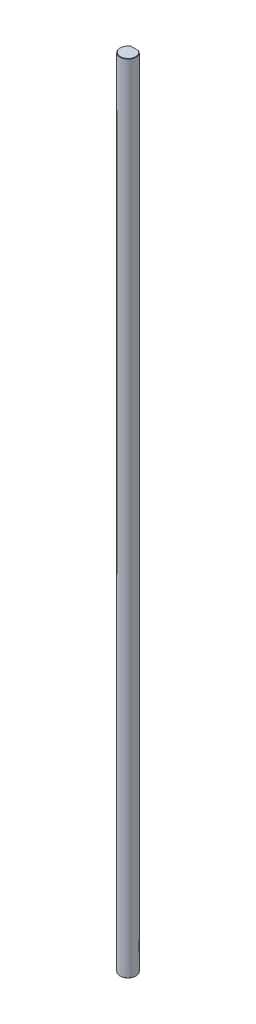
ISO-10303-21;
HEADER;
FILE_DESCRIPTION(('STEP AP214'),'2;1');
FILE_NAME('part.step','',(''),(''),'','','');
FILE_SCHEMA(('AUTOMOTIVE_DESIGN { 1 0 10303 214 1 1 1 1 }'));
ENDSEC;
DATA;
#1=APPLICATION_CONTEXT('core data for automotive mechanical design processes');
#2=APPLICATION_PROTOCOL_DEFINITION('international standard','automotive_design',2000,#1);
#3=PRODUCT_CONTEXT('',#1,'mechanical');
#4=PRODUCT('Part','Part','',(#3));
#5=PRODUCT_RELATED_PRODUCT_CATEGORY('part','',(#4));
#6=PRODUCT_DEFINITION_FORMATION('','',#4);
#7=PRODUCT_DEFINITION_CONTEXT('part definition',#1,'design');
#8=PRODUCT_DEFINITION('design','',#6,#7);
#9=PRODUCT_DEFINITION_SHAPE('','',#8);
#10=(LENGTH_UNIT() NAMED_UNIT(*) SI_UNIT(.MILLI.,.METRE.));
#11=(NAMED_UNIT(*) PLANE_ANGLE_UNIT() SI_UNIT($,.RADIAN.));
#12=(NAMED_UNIT(*) SI_UNIT($,.STERADIAN.) SOLID_ANGLE_UNIT());
#13=UNCERTAINTY_MEASURE_WITH_UNIT(LENGTH_MEASURE(1.E-05),#10,'distance_accuracy_value','');
#14=(GEOMETRIC_REPRESENTATION_CONTEXT(3) GLOBAL_UNCERTAINTY_ASSIGNED_CONTEXT((#13)) GLOBAL_UNIT_ASSIGNED_CONTEXT((#10,
#11,#12)) REPRESENTATION_CONTEXT('',''));
#15=CARTESIAN_POINT('',(0.,0.,0.));
#16=DIRECTION('',(0.,0.,1.));
#17=DIRECTION('',(1.,0.,0.));
#18=AXIS2_PLACEMENT_3D('',#15,#16,#17);
#19=CARTESIAN_POINT('',(0.,300.,0.));
#20=DIRECTION('',(0.,-1.,0.));
#21=DIRECTION('',(0.,0.,-1.));
#22=AXIS2_PLACEMENT_3D('',#19,#20,#21);
#23=CONICAL_SURFACE('',#22,2.875,0.785398163397439);
#24=CARTESIAN_POINT('',(-1.6583123951777,299.875,-2.5));
#25=CARTESIAN_POINT('',(-1.57973572193477,299.918434890403,-2.5));
#26=CARTESIAN_POINT('',(-1.50022900034243,299.960246696464,-2.5));
#27=CARTESIAN_POINT('',(-1.4197270864501,300.,-2.5));
#28=B_SPLINE_CURVE_WITH_KNOTS('',3,(#24,#25,#26,#27),.UNSPECIFIED.,.F.,.F.,(4,4),(0.,
0.000269347265701059),.UNSPECIFIED.);
#29=CARTESIAN_POINT('',(-1.6583123951777,299.875,-2.5));
#30=VERTEX_POINT('',#29);
#31=CARTESIAN_POINT('',(-1.4197270864501,300.,-2.5));
#32=VERTEX_POINT('',#31);
#33=EDGE_CURVE('E113',#30,#32,#28,.T.);
#34=ORIENTED_EDGE('',*,*,#33,.F.);
#35=CARTESIAN_POINT('',(0.,299.875,0.));
#36=DIRECTION('',(0.,-1.,0.));
#37=DIRECTION('',(0.,0.,1.));
#38=AXIS2_PLACEMENT_3D('',#35,#36,#37);
#39=CIRCLE('',#38,3.);
#40=CARTESIAN_POINT('',(1.6583123951777,299.875,-2.5));
#41=VERTEX_POINT('',#40);
#42=EDGE_CURVE('E77',#41,#30,#39,.T.);
#43=ORIENTED_EDGE('',*,*,#42,.F.);
#44=CARTESIAN_POINT('',(1.4197270864501,300.,-2.5));
#45=CARTESIAN_POINT('',(1.50022900034241,299.960246696464,-2.5));
#46=CARTESIAN_POINT('',(1.57973572193477,299.918434890403,-2.5));
#47=CARTESIAN_POINT('',(1.6583123951777,299.875,-2.5));
#48=B_SPLINE_CURVE_WITH_KNOTS('',3,(#44,#45,#46,#47),.UNSPECIFIED.,.F.,.F.,(4,4),(0.,
0.000269347265701066),.UNSPECIFIED.);
#49=CARTESIAN_POINT('',(1.4197270864501,300.,-2.5));
#50=VERTEX_POINT('',#49);
#51=EDGE_CURVE('E34',#50,#41,#48,.T.);
#52=ORIENTED_EDGE('',*,*,#51,.F.);
#53=CARTESIAN_POINT('',(0.,300.,0.));
#54=DIRECTION('',(0.,1.,0.));
#55=DIRECTION('',(0.,0.,1.));
#56=AXIS2_PLACEMENT_3D('',#53,#54,#55);
#57=CIRCLE('',#56,2.875);
#58=EDGE_CURVE('E13',#32,#50,#57,.T.);
#59=ORIENTED_EDGE('',*,*,#58,.F.);
#60=EDGE_LOOP('',(#34,#43,#52,#59));
#61=FACE_BOUND('',#60,.T.);
#62=ADVANCED_FACE('F24',(#61),#23,.T.);
#63=CARTESIAN_POINT('',(0.,0.,0.));
#64=DIRECTION('',(0.,1.,0.));
#65=DIRECTION('',(0.,0.,1.));
#66=AXIS2_PLACEMENT_3D('',#63,#64,#65);
#67=PLANE('',#66);
#68=DIRECTION('',(1.,0.,0.));
#69=VECTOR('',#68,1.);
#70=CARTESIAN_POINT('',(0.,0.,-2.5));
#71=LINE('',#70,#69);
#72=CARTESIAN_POINT('',(-1.41972708645021,0.,-2.5));
#73=VERTEX_POINT('',#72);
#74=CARTESIAN_POINT('',(1.41972708645021,0.,-2.5));
#75=VERTEX_POINT('',#74);
#76=EDGE_CURVE('E89',#73,#75,#71,.T.);
#77=ORIENTED_EDGE('',*,*,#76,.T.);
#78=CARTESIAN_POINT('',(0.,0.,0.));
#79=DIRECTION('',(0.,-1.,0.));
#80=DIRECTION('',(0.,0.,1.));
#81=AXIS2_PLACEMENT_3D('',#78,#79,#80);
#82=CIRCLE('',#81,2.87500000000008);
#83=EDGE_CURVE('E98',#75,#73,#82,.T.);
#84=ORIENTED_EDGE('',*,*,#83,.T.);
#85=EDGE_LOOP('',(#77,#84));
#86=FACE_BOUND('',#85,.T.);
#87=ADVANCED_FACE('F156',(#86),#67,.F.);
#88=CARTESIAN_POINT('',(0.,300.,0.));
#89=DIRECTION('',(0.,1.,0.));
#90=DIRECTION('',(0.,0.,1.));
#91=AXIS2_PLACEMENT_3D('',#88,#89,#90);
#92=PLANE('',#91);
#93=DIRECTION('',(1.,0.,0.));
#94=VECTOR('',#93,1.);
#95=CARTESIAN_POINT('',(0.,300.,-2.5));
#96=LINE('',#95,#94);
#97=EDGE_CURVE('E116',#32,#50,#96,.T.);
#98=ORIENTED_EDGE('',*,*,#97,.F.);
#99=ORIENTED_EDGE('',*,*,#58,.T.);
#100=EDGE_LOOP('',(#98,#99));
#101=FACE_BOUND('',#100,.T.);
#102=ADVANCED_FACE('F158',(#101),#92,.T.);
#103=CARTESIAN_POINT('',(0.,300.,-2.5));
#104=DIRECTION('',(0.,0.,-1.));
#105=DIRECTION('',(-1.,0.,0.));
#106=AXIS2_PLACEMENT_3D('',#103,#104,#105);
#107=PLANE('',#106);
#108=DIRECTION('',(0.,-1.,0.));
#109=VECTOR('',#108,1.);
#110=CARTESIAN_POINT('',(1.6583123951777,300.,-2.5));
#111=LINE('',#110,#109);
#112=CARTESIAN_POINT('',(1.6583123951777,0.124999999999931,-2.5));
#113=VERTEX_POINT('',#112);
#114=EDGE_CURVE('E81',#41,#113,#111,.T.);
#115=ORIENTED_EDGE('',*,*,#114,.T.);
#116=CARTESIAN_POINT('',(1.6583123951777,0.124999999999931,-2.5));
#117=CARTESIAN_POINT('',(1.5797357219348,0.0815651095964221,-2.5));
#118=CARTESIAN_POINT('',(1.50022900034249,0.0397533035352561,-2.5));
#119=CARTESIAN_POINT('',(1.41972708645021,0.,-2.5));
#120=B_SPLINE_CURVE_WITH_KNOTS('',3,(#116,#117,#118,#119),.UNSPECIFIED.,.F.,.F.,(4,4),(0.,
0.000269347265700939),.UNSPECIFIED.);
#121=EDGE_CURVE('E96',#113,#75,#120,.T.);
#122=ORIENTED_EDGE('',*,*,#121,.T.);
#123=ORIENTED_EDGE('',*,*,#76,.F.);
#124=CARTESIAN_POINT('',(-1.41972708645021,0.,-2.5));
#125=CARTESIAN_POINT('',(-1.50022900034248,0.0397533035352803,-2.5));
#126=CARTESIAN_POINT('',(-1.57973572193481,0.0815651095964097,-2.5));
#127=CARTESIAN_POINT('',(-1.6583123951777,0.124999999999931,-2.5));
#128=B_SPLINE_CURVE_WITH_KNOTS('',3,(#124,#125,#126,#127),.UNSPECIFIED.,.F.,.F.,(4,4),(0.,
0.000269347265700938),.UNSPECIFIED.);
#129=CARTESIAN_POINT('',(-1.6583123951777,0.124999999999931,-2.5));
#130=VERTEX_POINT('',#129);
#131=EDGE_CURVE('E82',#73,#130,#128,.T.);
#132=ORIENTED_EDGE('',*,*,#131,.T.);
#133=DIRECTION('',(0.,-1.,0.));
#134=VECTOR('',#133,1.);
#135=CARTESIAN_POINT('',(-1.6583123951777,300.,-2.5));
#136=LINE('',#135,#134);
#137=EDGE_CURVE('E69',#30,#130,#136,.T.);
#138=ORIENTED_EDGE('',*,*,#137,.F.);
#139=ORIENTED_EDGE('',*,*,#33,.T.);
#140=ORIENTED_EDGE('',*,*,#97,.T.);
#141=ORIENTED_EDGE('',*,*,#51,.T.);
#142=EDGE_LOOP('',(#115,#122,#123,#132,#138,#139,#140,#141));
#143=FACE_BOUND('',#142,.T.);
#144=ADVANCED_FACE('F86',(#143),#107,.T.);
#145=CARTESIAN_POINT('',(0.,300.,0.));
#146=DIRECTION('',(0.,-1.,0.));
#147=DIRECTION('',(0.,0.,-1.));
#148=AXIS2_PLACEMENT_3D('',#145,#146,#147);
#149=CYLINDRICAL_SURFACE('',#148,3.);
#150=ORIENTED_EDGE('',*,*,#137,.T.);
#151=CARTESIAN_POINT('',(0.,0.124999999999931,0.));
#152=DIRECTION('',(0.,1.,0.));
#153=DIRECTION('',(0.,0.,1.));
#154=AXIS2_PLACEMENT_3D('',#151,#152,#153);
#155=CIRCLE('',#154,3.);
#156=EDGE_CURVE('E74',#130,#113,#155,.T.);
#157=ORIENTED_EDGE('',*,*,#156,.T.);
#158=ORIENTED_EDGE('',*,*,#114,.F.);
#159=ORIENTED_EDGE('',*,*,#42,.T.);
#160=EDGE_LOOP('',(#150,#157,#158,#159));
#161=FACE_BOUND('',#160,.T.);
#162=ADVANCED_FACE('F71',(#161),#149,.T.);
#163=CARTESIAN_POINT('',(0.,0.124999999999931,0.));
#164=DIRECTION('',(0.,1.,0.));
#165=DIRECTION('',(0.,0.,1.));
#166=AXIS2_PLACEMENT_3D('',#163,#164,#165);
#167=CONICAL_SURFACE('',#166,3.,0.785398163397438);
#168=ORIENTED_EDGE('',*,*,#83,.F.);
#169=ORIENTED_EDGE('',*,*,#121,.F.);
#170=ORIENTED_EDGE('',*,*,#156,.F.);
#171=ORIENTED_EDGE('',*,*,#131,.F.);
#172=EDGE_LOOP('',(#168,#169,#170,#171));
#173=FACE_BOUND('',#172,.T.);
#174=ADVANCED_FACE('F95',(#173),#167,.T.);
#175=CLOSED_SHELL('',(#62,#87,#102,#144,#162,#174));
#176=MANIFOLD_SOLID_BREP('B1',#175);
#177=ADVANCED_BREP_SHAPE_REPRESENTATION('',(#18,#176),#14);
#178=SHAPE_DEFINITION_REPRESENTATION(#9,#177);
ENDSEC;
END-ISO-10303-21;
